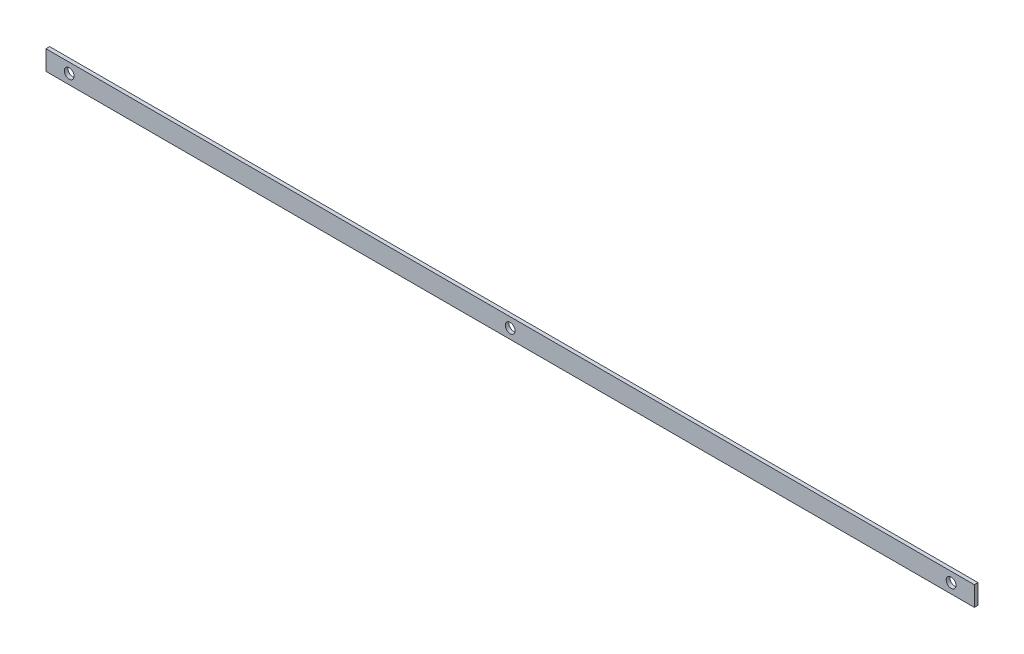
ISO-10303-21;
HEADER;
FILE_DESCRIPTION(('STEP AP214'),'2;1');
FILE_NAME('part.step','',(''),(''),'','','');
FILE_SCHEMA(('AUTOMOTIVE_DESIGN { 1 0 10303 214 1 1 1 1 }'));
ENDSEC;
DATA;
#1=APPLICATION_CONTEXT('core data for automotive mechanical design processes');
#2=APPLICATION_PROTOCOL_DEFINITION('international standard','automotive_design',2000,#1);
#3=PRODUCT_CONTEXT('',#1,'mechanical');
#4=PRODUCT('Part','Part','',(#3));
#5=PRODUCT_RELATED_PRODUCT_CATEGORY('part','',(#4));
#6=PRODUCT_DEFINITION_FORMATION('','',#4);
#7=PRODUCT_DEFINITION_CONTEXT('part definition',#1,'design');
#8=PRODUCT_DEFINITION('design','',#6,#7);
#9=PRODUCT_DEFINITION_SHAPE('','',#8);
#10=(LENGTH_UNIT() NAMED_UNIT(*) SI_UNIT(.MILLI.,.METRE.));
#11=(NAMED_UNIT(*) PLANE_ANGLE_UNIT() SI_UNIT($,.RADIAN.));
#12=(NAMED_UNIT(*) SI_UNIT($,.STERADIAN.) SOLID_ANGLE_UNIT());
#13=UNCERTAINTY_MEASURE_WITH_UNIT(LENGTH_MEASURE(1.E-05),#10,'distance_accuracy_value','');
#14=(GEOMETRIC_REPRESENTATION_CONTEXT(3) GLOBAL_UNCERTAINTY_ASSIGNED_CONTEXT((#13)) GLOBAL_UNIT_ASSIGNED_CONTEXT((#10,
#11,#12)) REPRESENTATION_CONTEXT('',''));
#15=CARTESIAN_POINT('',(0.,0.,0.));
#16=DIRECTION('',(0.,0.,1.));
#17=DIRECTION('',(1.,0.,0.));
#18=AXIS2_PLACEMENT_3D('',#15,#16,#17);
#19=CARTESIAN_POINT('',(0.,0.,9.525));
#20=DIRECTION('',(1.,0.,0.));
#21=DIRECTION('',(0.,1.,0.));
#22=AXIS2_PLACEMENT_3D('',#19,#20,#21);
#23=PLANE('',#22);
#24=DIRECTION('',(0.,-1.,0.));
#25=VECTOR('',#24,1.);
#26=CARTESIAN_POINT('',(0.,0.,0.));
#27=LINE('',#26,#25);
#28=CARTESIAN_POINT('',(0.,0.,0.));
#29=VERTEX_POINT('',#28);
#30=CARTESIAN_POINT('',(0.,-50.8,0.));
#31=VERTEX_POINT('',#30);
#32=EDGE_CURVE('E99',#29,#31,#27,.T.);
#33=ORIENTED_EDGE('',*,*,#32,.T.);
#34=DIRECTION('',(0.,0.,-1.));
#35=VECTOR('',#34,1.);
#36=CARTESIAN_POINT('',(0.,-50.8,9.525));
#37=LINE('',#36,#35);
#38=CARTESIAN_POINT('',(0.,-50.8,9.525));
#39=VERTEX_POINT('',#38);
#40=EDGE_CURVE('E11',#39,#31,#37,.T.);
#41=ORIENTED_EDGE('',*,*,#40,.F.);
#42=DIRECTION('',(0.,-1.,0.));
#43=VECTOR('',#42,1.);
#44=CARTESIAN_POINT('',(0.,0.,9.525));
#45=LINE('',#44,#43);
#46=CARTESIAN_POINT('',(0.,0.,9.525));
#47=VERTEX_POINT('',#46);
#48=EDGE_CURVE('E86',#47,#39,#45,.T.);
#49=ORIENTED_EDGE('',*,*,#48,.F.);
#50=DIRECTION('',(0.,0.,-1.));
#51=VECTOR('',#50,1.);
#52=CARTESIAN_POINT('',(0.,0.,9.525));
#53=LINE('',#52,#51);
#54=EDGE_CURVE('E95',#47,#29,#53,.T.);
#55=ORIENTED_EDGE('',*,*,#54,.T.);
#56=EDGE_LOOP('',(#33,#41,#49,#55));
#57=FACE_BOUND('',#56,.T.);
#58=ADVANCED_FACE('F33',(#57),#23,.F.);
#59=CARTESIAN_POINT('',(0.,-50.8,9.525));
#60=DIRECTION('',(0.,1.,0.));
#61=DIRECTION('',(0.,0.,1.));
#62=AXIS2_PLACEMENT_3D('',#59,#60,#61);
#63=PLANE('',#62);
#64=DIRECTION('',(1.,0.,0.));
#65=VECTOR('',#64,1.);
#66=CARTESIAN_POINT('',(0.,-50.8,0.));
#67=LINE('',#66,#65);
#68=CARTESIAN_POINT('',(2400.,-50.8,0.));
#69=VERTEX_POINT('',#68);
#70=EDGE_CURVE('E90',#31,#69,#67,.T.);
#71=ORIENTED_EDGE('',*,*,#70,.T.);
#72=DIRECTION('',(0.,0.,-1.));
#73=VECTOR('',#72,1.);
#74=CARTESIAN_POINT('',(2400.,-50.8,9.525));
#75=LINE('',#74,#73);
#76=CARTESIAN_POINT('',(2400.,-50.8,9.525));
#77=VERTEX_POINT('',#76);
#78=EDGE_CURVE('E42',#77,#69,#75,.T.);
#79=ORIENTED_EDGE('',*,*,#78,.F.);
#80=DIRECTION('',(1.,0.,0.));
#81=VECTOR('',#80,1.);
#82=CARTESIAN_POINT('',(0.,-50.8,9.525));
#83=LINE('',#82,#81);
#84=EDGE_CURVE('E81',#39,#77,#83,.T.);
#85=ORIENTED_EDGE('',*,*,#84,.F.);
#86=ORIENTED_EDGE('',*,*,#40,.T.);
#87=EDGE_LOOP('',(#71,#79,#85,#86));
#88=FACE_BOUND('',#87,.T.);
#89=ADVANCED_FACE('F89',(#88),#63,.F.);
#90=CARTESIAN_POINT('',(2400.,0.,9.525));
#91=DIRECTION('',(-1.,0.,0.));
#92=DIRECTION('',(0.,0.,1.));
#93=AXIS2_PLACEMENT_3D('',#90,#91,#92);
#94=PLANE('',#93);
#95=DIRECTION('',(0.,1.,0.));
#96=VECTOR('',#95,1.);
#97=CARTESIAN_POINT('',(2400.,0.,0.));
#98=LINE('',#97,#96);
#99=CARTESIAN_POINT('',(2400.,0.,0.));
#100=VERTEX_POINT('',#99);
#101=EDGE_CURVE('E68',#69,#100,#98,.T.);
#102=ORIENTED_EDGE('',*,*,#101,.T.);
#103=DIRECTION('',(0.,0.,-1.));
#104=VECTOR('',#103,1.);
#105=CARTESIAN_POINT('',(2400.,0.,9.525));
#106=LINE('',#105,#104);
#107=CARTESIAN_POINT('',(2400.,0.,9.525));
#108=VERTEX_POINT('',#107);
#109=EDGE_CURVE('E91',#108,#100,#106,.T.);
#110=ORIENTED_EDGE('',*,*,#109,.F.);
#111=DIRECTION('',(0.,1.,0.));
#112=VECTOR('',#111,1.);
#113=CARTESIAN_POINT('',(2400.,0.,9.525));
#114=LINE('',#113,#112);
#115=EDGE_CURVE('E84',#77,#108,#114,.T.);
#116=ORIENTED_EDGE('',*,*,#115,.F.);
#117=ORIENTED_EDGE('',*,*,#78,.T.);
#118=EDGE_LOOP('',(#102,#110,#116,#117));
#119=FACE_BOUND('',#118,.T.);
#120=ADVANCED_FACE('F93',(#119),#94,.F.);
#121=CARTESIAN_POINT('',(0.,0.,9.525));
#122=DIRECTION('',(0.,-1.,0.));
#123=DIRECTION('',(0.,0.,-1.));
#124=AXIS2_PLACEMENT_3D('',#121,#122,#123);
#125=PLANE('',#124);
#126=DIRECTION('',(-1.,0.,0.));
#127=VECTOR('',#126,1.);
#128=CARTESIAN_POINT('',(0.,0.,0.));
#129=LINE('',#128,#127);
#130=EDGE_CURVE('E74',#100,#29,#129,.T.);
#131=ORIENTED_EDGE('',*,*,#130,.T.);
#132=ORIENTED_EDGE('',*,*,#54,.F.);
#133=DIRECTION('',(-1.,0.,0.));
#134=VECTOR('',#133,1.);
#135=CARTESIAN_POINT('',(0.,0.,9.525));
#136=LINE('',#135,#134);
#137=EDGE_CURVE('E51',#108,#47,#136,.T.);
#138=ORIENTED_EDGE('',*,*,#137,.F.);
#139=ORIENTED_EDGE('',*,*,#109,.T.);
#140=EDGE_LOOP('',(#131,#132,#138,#139));
#141=FACE_BOUND('',#140,.T.);
#142=ADVANCED_FACE('F132',(#141),#125,.F.);
#143=CARTESIAN_POINT('',(0.,0.,9.525));
#144=DIRECTION('',(0.,0.,1.));
#145=DIRECTION('',(1.,0.,0.));
#146=AXIS2_PLACEMENT_3D('',#143,#144,#145);
#147=PLANE('',#146);
#148=CARTESIAN_POINT('',(2340.,-25.3999999999997,9.525));
#149=DIRECTION('',(0.,0.,1.));
#150=DIRECTION('',(-1.,0.,0.));
#151=AXIS2_PLACEMENT_3D('',#148,#149,#150);
#152=CIRCLE('',#151,12.6999999999999);
#153=CARTESIAN_POINT('',(2327.3,-25.3999999999997,9.525));
#154=VERTEX_POINT('',#153);
#155=EDGE_CURVE('E112',#154,#154,#152,.T.);
#156=ORIENTED_EDGE('',*,*,#155,.F.);
#157=EDGE_LOOP('',(#156));
#158=FACE_BOUND('',#157,.T.);
#159=CARTESIAN_POINT('',(1200.,-25.4,9.525));
#160=DIRECTION('',(0.,0.,1.));
#161=DIRECTION('',(1.,0.,0.));
#162=AXIS2_PLACEMENT_3D('',#159,#160,#161);
#163=CIRCLE('',#162,12.6999999999999);
#164=CARTESIAN_POINT('',(1212.7,-25.4,9.525));
#165=VERTEX_POINT('',#164);
#166=EDGE_CURVE('E117',#165,#165,#163,.T.);
#167=ORIENTED_EDGE('',*,*,#166,.F.);
#168=EDGE_LOOP('',(#167));
#169=FACE_BOUND('',#168,.T.);
#170=CARTESIAN_POINT('',(60.,-25.4,9.525));
#171=DIRECTION('',(0.,0.,1.));
#172=DIRECTION('',(1.,0.,0.));
#173=AXIS2_PLACEMENT_3D('',#170,#171,#172);
#174=CIRCLE('',#173,12.7);
#175=CARTESIAN_POINT('',(72.7,-25.4,9.525));
#176=VERTEX_POINT('',#175);
#177=EDGE_CURVE('E109',#176,#176,#174,.T.);
#178=ORIENTED_EDGE('',*,*,#177,.F.);
#179=EDGE_LOOP('',(#178));
#180=FACE_BOUND('',#179,.T.);
#181=ORIENTED_EDGE('',*,*,#48,.T.);
#182=ORIENTED_EDGE('',*,*,#84,.T.);
#183=ORIENTED_EDGE('',*,*,#115,.T.);
#184=ORIENTED_EDGE('',*,*,#137,.T.);
#185=EDGE_LOOP('',(#181,#182,#183,#184));
#186=FACE_BOUND('',#185,.T.);
#187=ADVANCED_FACE('F82',(#158,#169,#180,#186),#147,.T.);
#188=CARTESIAN_POINT('',(0.,0.,0.));
#189=DIRECTION('',(0.,0.,1.));
#190=DIRECTION('',(1.,0.,0.));
#191=AXIS2_PLACEMENT_3D('',#188,#189,#190);
#192=PLANE('',#191);
#193=CARTESIAN_POINT('',(2340.,-25.3999999999997,0.));
#194=DIRECTION('',(0.,0.,1.));
#195=DIRECTION('',(1.,0.,0.));
#196=AXIS2_PLACEMENT_3D('',#193,#194,#195);
#197=CIRCLE('',#196,12.6999999999999);
#198=CARTESIAN_POINT('',(2352.7,-25.3999999999997,0.));
#199=VERTEX_POINT('',#198);
#200=EDGE_CURVE('E36',#199,#199,#197,.T.);
#201=ORIENTED_EDGE('',*,*,#200,.T.);
#202=EDGE_LOOP('',(#201));
#203=FACE_BOUND('',#202,.T.);
#204=CARTESIAN_POINT('',(1200.,-25.4,0.));
#205=DIRECTION('',(0.,0.,1.));
#206=DIRECTION('',(1.,0.,0.));
#207=AXIS2_PLACEMENT_3D('',#204,#205,#206);
#208=CIRCLE('',#207,12.6999999999999);
#209=CARTESIAN_POINT('',(1212.7,-25.4,0.));
#210=VERTEX_POINT('',#209);
#211=EDGE_CURVE('E110',#210,#210,#208,.T.);
#212=ORIENTED_EDGE('',*,*,#211,.T.);
#213=EDGE_LOOP('',(#212));
#214=FACE_BOUND('',#213,.T.);
#215=CARTESIAN_POINT('',(60.,-25.4,0.));
#216=DIRECTION('',(0.,0.,1.));
#217=DIRECTION('',(1.,0.,0.));
#218=AXIS2_PLACEMENT_3D('',#215,#216,#217);
#219=CIRCLE('',#218,12.7);
#220=CARTESIAN_POINT('',(72.7,-25.4,0.));
#221=VERTEX_POINT('',#220);
#222=EDGE_CURVE('E102',#221,#221,#219,.T.);
#223=ORIENTED_EDGE('',*,*,#222,.T.);
#224=EDGE_LOOP('',(#223));
#225=FACE_BOUND('',#224,.T.);
#226=ORIENTED_EDGE('',*,*,#32,.F.);
#227=ORIENTED_EDGE('',*,*,#130,.F.);
#228=ORIENTED_EDGE('',*,*,#101,.F.);
#229=ORIENTED_EDGE('',*,*,#70,.F.);
#230=EDGE_LOOP('',(#226,#227,#228,#229));
#231=FACE_BOUND('',#230,.T.);
#232=ADVANCED_FACE('F131',(#203,#214,#225,#231),#192,.F.);
#233=CARTESIAN_POINT('',(60.,-25.4,-10.475));
#234=DIRECTION('',(0.,0.,1.));
#235=DIRECTION('',(1.,0.,0.));
#236=AXIS2_PLACEMENT_3D('',#233,#234,#235);
#237=CYLINDRICAL_SURFACE('',#236,12.7);
#238=ORIENTED_EDGE('',*,*,#177,.T.);
#239=EDGE_LOOP('',(#238));
#240=FACE_BOUND('',#239,.T.);
#241=ORIENTED_EDGE('',*,*,#222,.F.);
#242=EDGE_LOOP('',(#241));
#243=FACE_BOUND('',#242,.T.);
#244=ADVANCED_FACE('F127',(#240,#243),#237,.F.);
#245=CARTESIAN_POINT('',(1200.,-25.4,-10.475));
#246=DIRECTION('',(0.,0.,1.));
#247=DIRECTION('',(1.,0.,0.));
#248=AXIS2_PLACEMENT_3D('',#245,#246,#247);
#249=CYLINDRICAL_SURFACE('',#248,12.6999999999999);
#250=ORIENTED_EDGE('',*,*,#166,.T.);
#251=EDGE_LOOP('',(#250));
#252=FACE_BOUND('',#251,.T.);
#253=ORIENTED_EDGE('',*,*,#211,.F.);
#254=EDGE_LOOP('',(#253));
#255=FACE_BOUND('',#254,.T.);
#256=ADVANCED_FACE('F180',(#252,#255),#249,.F.);
#257=CARTESIAN_POINT('',(2340.,-25.3999999999997,-10.475));
#258=DIRECTION('',(0.,0.,1.));
#259=DIRECTION('',(1.,0.,0.));
#260=AXIS2_PLACEMENT_3D('',#257,#258,#259);
#261=CYLINDRICAL_SURFACE('',#260,12.6999999999999);
#262=ORIENTED_EDGE('',*,*,#155,.T.);
#263=EDGE_LOOP('',(#262));
#264=FACE_BOUND('',#263,.T.);
#265=ORIENTED_EDGE('',*,*,#200,.F.);
#266=EDGE_LOOP('',(#265));
#267=FACE_BOUND('',#266,.T.);
#268=ADVANCED_FACE('F188',(#264,#267),#261,.F.);
#269=CLOSED_SHELL('',(#58,#89,#120,#142,#187,#232,#244,#256,#268));
#270=MANIFOLD_SOLID_BREP('B2',#269);
#271=ADVANCED_BREP_SHAPE_REPRESENTATION('',(#18,#270),#14);
#272=SHAPE_DEFINITION_REPRESENTATION(#9,#271);
ENDSEC;
END-ISO-10303-21;
